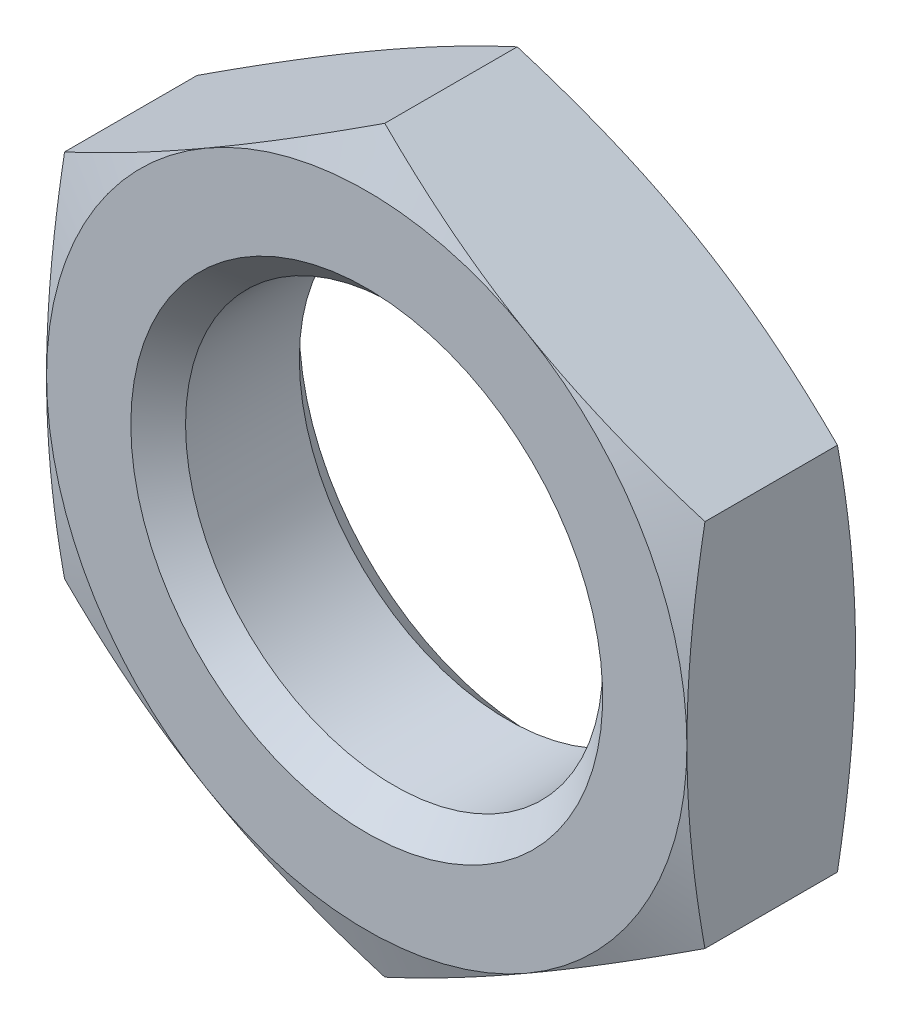
ISO-10303-21;
HEADER;
FILE_DESCRIPTION(('STEP AP214'),'2;1');
FILE_NAME('part.step','',(''),(''),'','','');
FILE_SCHEMA(('AUTOMOTIVE_DESIGN { 1 0 10303 214 1 1 1 1 }'));
ENDSEC;
DATA;
#1=APPLICATION_CONTEXT('core data for automotive mechanical design processes');
#2=APPLICATION_PROTOCOL_DEFINITION('international standard','automotive_design',2000,#1);
#3=PRODUCT_CONTEXT('',#1,'mechanical');
#4=PRODUCT('Part','Part','',(#3));
#5=PRODUCT_RELATED_PRODUCT_CATEGORY('part','',(#4));
#6=PRODUCT_DEFINITION_FORMATION('','',#4);
#7=PRODUCT_DEFINITION_CONTEXT('part definition',#1,'design');
#8=PRODUCT_DEFINITION('design','',#6,#7);
#9=PRODUCT_DEFINITION_SHAPE('','',#8);
#10=(LENGTH_UNIT() NAMED_UNIT(*) SI_UNIT(.MILLI.,.METRE.));
#11=(NAMED_UNIT(*) PLANE_ANGLE_UNIT() SI_UNIT($,.RADIAN.));
#12=(NAMED_UNIT(*) SI_UNIT($,.STERADIAN.) SOLID_ANGLE_UNIT());
#13=UNCERTAINTY_MEASURE_WITH_UNIT(LENGTH_MEASURE(1.E-05),#10,'distance_accuracy_value','');
#14=(GEOMETRIC_REPRESENTATION_CONTEXT(3) GLOBAL_UNCERTAINTY_ASSIGNED_CONTEXT((#13)) GLOBAL_UNIT_ASSIGNED_CONTEXT((#10,
#11,#12)) REPRESENTATION_CONTEXT('',''));
#15=CARTESIAN_POINT('',(0.,0.,0.));
#16=DIRECTION('',(0.,0.,1.));
#17=DIRECTION('',(1.,0.,0.));
#18=AXIS2_PLACEMENT_3D('',#15,#16,#17);
#19=CARTESIAN_POINT('',(0.,0.,-68.));
#20=DIRECTION('',(0.,0.,1.));
#21=DIRECTION('',(1.,0.,0.));
#22=AXIS2_PLACEMENT_3D('',#19,#20,#21);
#23=PLANE('',#22);
#24=CARTESIAN_POINT('',(0.,0.,-68.));
#25=DIRECTION('',(0.,0.,-1.));
#26=DIRECTION('',(-1.,0.,0.));
#27=AXIS2_PLACEMENT_3D('',#24,#25,#26);
#28=CIRCLE('',#27,7.);
#29=CARTESIAN_POINT('',(-7.,0.,-68.));
#30=VERTEX_POINT('',#29);
#31=EDGE_CURVE('E150',#30,#30,#28,.T.);
#32=ORIENTED_EDGE('',*,*,#31,.T.);
#33=EDGE_LOOP('',(#32));
#34=FACE_BOUND('',#33,.T.);
#35=CARTESIAN_POINT('',(0.,0.,-68.));
#36=DIRECTION('',(0.,0.,-1.));
#37=DIRECTION('',(1.,0.,0.));
#38=AXIS2_PLACEMENT_3D('',#35,#36,#37);
#39=CIRCLE('',#38,9.5);
#40=CARTESIAN_POINT('',(9.5,0.,-68.));
#41=VERTEX_POINT('',#40);
#42=CARTESIAN_POINT('',(4.7500000000001,-8.22724133595211,-68.));
#43=VERTEX_POINT('',#42);
#44=EDGE_CURVE('E135',#41,#43,#39,.T.);
#45=ORIENTED_EDGE('',*,*,#44,.F.);
#46=CARTESIAN_POINT('',(0.,0.,-68.));
#47=DIRECTION('',(0.,0.,-1.));
#48=DIRECTION('',(0.50000000000001,0.866025403784433,0.));
#49=AXIS2_PLACEMENT_3D('',#46,#47,#48);
#50=CIRCLE('',#49,9.5);
#51=CARTESIAN_POINT('',(4.7500000000001,8.22724133595211,-68.));
#52=VERTEX_POINT('',#51);
#53=EDGE_CURVE('E145',#52,#41,#50,.T.);
#54=ORIENTED_EDGE('',*,*,#53,.F.);
#55=CARTESIAN_POINT('',(0.,0.,-68.));
#56=DIRECTION('',(0.,0.,-1.));
#57=DIRECTION('',(-0.50000000000001,0.866025403784433,0.));
#58=AXIS2_PLACEMENT_3D('',#55,#56,#57);
#59=CIRCLE('',#58,9.5);
#60=CARTESIAN_POINT('',(-4.7500000000001,8.22724133595211,-68.));
#61=VERTEX_POINT('',#60);
#62=EDGE_CURVE('E154',#61,#52,#59,.T.);
#63=ORIENTED_EDGE('',*,*,#62,.F.);
#64=CARTESIAN_POINT('',(0.,0.,-68.));
#65=DIRECTION('',(0.,0.,-1.));
#66=DIRECTION('',(-1.,0.,0.));
#67=AXIS2_PLACEMENT_3D('',#64,#65,#66);
#68=CIRCLE('',#67,9.5);
#69=CARTESIAN_POINT('',(-9.5,0.,-68.));
#70=VERTEX_POINT('',#69);
#71=EDGE_CURVE('E156',#70,#61,#68,.T.);
#72=ORIENTED_EDGE('',*,*,#71,.F.);
#73=CARTESIAN_POINT('',(0.,0.,-68.));
#74=DIRECTION('',(0.,0.,-1.));
#75=DIRECTION('',(-0.50000000000001,-0.866025403784433,0.));
#76=AXIS2_PLACEMENT_3D('',#73,#74,#75);
#77=CIRCLE('',#76,9.5);
#78=CARTESIAN_POINT('',(-4.7500000000001,-8.22724133595211,-68.));
#79=VERTEX_POINT('',#78);
#80=EDGE_CURVE('E167',#79,#70,#77,.T.);
#81=ORIENTED_EDGE('',*,*,#80,.F.);
#82=CARTESIAN_POINT('',(0.,0.,-68.));
#83=DIRECTION('',(0.,0.,-1.));
#84=DIRECTION('',(0.50000000000001,-0.866025403784433,0.));
#85=AXIS2_PLACEMENT_3D('',#82,#83,#84);
#86=CIRCLE('',#85,9.5);
#87=EDGE_CURVE('E149',#43,#79,#86,.T.);
#88=ORIENTED_EDGE('',*,*,#87,.F.);
#89=EDGE_LOOP('',(#45,#54,#63,#72,#81,#88));
#90=FACE_BOUND('',#89,.T.);
#91=ADVANCED_FACE('F17',(#34,#90),#23,.T.);
#92=CARTESIAN_POINT('',(0.,0.,-68.));
#93=DIRECTION('',(0.,0.,1.));
#94=DIRECTION('',(1.,0.,0.));
#95=AXIS2_PLACEMENT_3D('',#92,#93,#94);
#96=CONICAL_SURFACE('',#95,7.,0.78539816339746);
#97=CARTESIAN_POINT('',(0.,0.,-68.812));
#98=DIRECTION('',(0.,0.,-1.));
#99=DIRECTION('',(-1.,0.,0.));
#100=AXIS2_PLACEMENT_3D('',#97,#98,#99);
#101=CIRCLE('',#100,6.188);
#102=CARTESIAN_POINT('',(-6.188,0.,-68.812));
#103=VERTEX_POINT('',#102);
#104=EDGE_CURVE('E138',#103,#103,#101,.T.);
#105=ORIENTED_EDGE('',*,*,#104,.T.);
#106=EDGE_LOOP('',(#105));
#107=FACE_BOUND('',#106,.T.);
#108=ORIENTED_EDGE('',*,*,#31,.F.);
#109=EDGE_LOOP('',(#108));
#110=FACE_BOUND('',#109,.T.);
#111=ADVANCED_FACE('F179',(#107,#110),#96,.F.);
#112=CARTESIAN_POINT('',(0.,0.,-68.));
#113=DIRECTION('',(0.,0.,-1.));
#114=DIRECTION('',(-1.,0.,0.));
#115=AXIS2_PLACEMENT_3D('',#112,#113,#114);
#116=CONICAL_SURFACE('',#115,9.5,1.22173047639622);
#117=CARTESIAN_POINT('',(9.5,1.38348499670315E-06,-68.0000000000001));
#118=CARTESIAN_POINT('',(9.5,-0.464012820198954,-67.999999975405));
#119=CARTESIAN_POINT('',(9.5,-0.929416929238858,-68.0125279841931));
#120=CARTESIAN_POINT('',(9.5,-1.85271083849305,-68.0612160638646));
#121=CARTESIAN_POINT('',(9.5,-2.31114037189935,-68.097264507324));
#122=CARTESIAN_POINT('',(9.5,-3.22524518274052,-68.1903406242432));
#123=CARTESIAN_POINT('',(9.5,-3.67928453926669,-68.2471816991538));
#124=CARTESIAN_POINT('',(9.5,-4.35871646390742,-68.3458200965081));
#125=CARTESIAN_POINT('',(9.5,-4.58438216619538,-68.380850645372));
#126=CARTESIAN_POINT('',(9.5,-4.92256697816938,-68.4364504855607));
#127=CARTESIAN_POINT('',(9.5,-5.03514353656033,-68.4554771751788));
#128=CARTESIAN_POINT('',(9.5,-5.26014128155568,-68.494491784782));
#129=CARTESIAN_POINT('',(9.5,-5.37251523150554,-68.5144715433614));
#130=CARTESIAN_POINT('',(9.5,-5.48482799568445,-68.5349107961312));
#131=B_SPLINE_CURVE_WITH_KNOTS('',3,(#117,#118,#119,#120,#121,#122,#123,#124,#125,#126,#127,
#128,#129,#130),.UNSPECIFIED.,.F.,.F.,(4,2,2,2,2,2,4),(16.8427370557451,18.2242554711314,
19.6057738865176,20.9872923019039,21.678051509597,22.0234311134436,22.3688107172901),.UNSPECIFIED.);
#132=CARTESIAN_POINT('',(9.5,-5.4848275573014,-68.5349107163522));
#133=VERTEX_POINT('',#132);
#134=EDGE_CURVE('E116',#41,#133,#131,.T.);
#135=ORIENTED_EDGE('',*,*,#134,.F.);
#136=ORIENTED_EDGE('',*,*,#44,.T.);
#137=CARTESIAN_POINT('',(9.50000000003373,-5.48482755728192,-68.5349107163593));
#138=CARTESIAN_POINT('',(8.71314308510471,-5.93911960892993,-68.3695619318949));
#139=CARTESIAN_POINT('',(7.91972598113348,-6.39719918748738,-68.2338856319153));
#140=CARTESIAN_POINT('',(6.33363378100409,-7.31292994619168,-68.0488840555385));
#141=CARTESIAN_POINT('',(5.54432931596682,-7.76863509155353,-68.));
#142=CARTESIAN_POINT('',(4.75000000000011,-8.22724133595213,-68.));
#143=B_SPLINE_CURVE_WITH_KNOTS('',3,(#137,#138,#139,#140,#141,#142),.UNSPECIFIED.,.F.,.F.,(4,2,
4),(0.000230940107676242,2.74264471875835,5.48505849740902),.UNSPECIFIED.);
#144=EDGE_CURVE('E136',#133,#43,#143,.T.);
#145=ORIENTED_EDGE('',*,*,#144,.F.);
#146=EDGE_LOOP('',(#135,#136,#145));
#147=FACE_BOUND('',#146,.T.);
#148=ADVANCED_FACE('F134',(#147),#116,.T.);
#149=CARTESIAN_POINT('',(4.75000000000011,8.22724133595213,-68.));
#150=CARTESIAN_POINT('',(5.54432931596682,7.76863509155353,-68.));
#151=CARTESIAN_POINT('',(6.33363378100409,7.31292994619168,-68.0488840555385));
#152=CARTESIAN_POINT('',(7.91972598113348,6.39719918748738,-68.2338856319153));
#153=CARTESIAN_POINT('',(8.71314308510471,5.93911960892993,-68.3695619318949));
#154=CARTESIAN_POINT('',(9.50000000003374,5.48482755728192,-68.5349107163593));
#155=B_SPLINE_CURVE_WITH_KNOTS('',3,(#149,#150,#151,#152,#153,#154),.UNSPECIFIED.,.F.,.F.,(4,2,
4),(5.4850584974093,8.22747227605997,10.9698860547106),.UNSPECIFIED.);
#156=CARTESIAN_POINT('',(9.5,5.4848275573014,-68.5349107163522));
#157=VERTEX_POINT('',#156);
#158=EDGE_CURVE('E126',#52,#157,#155,.T.);
#159=ORIENTED_EDGE('',*,*,#158,.F.);
#160=ORIENTED_EDGE('',*,*,#53,.T.);
#161=CARTESIAN_POINT('',(9.5,5.48482732909347,-68.5349106748217));
#162=CARTESIAN_POINT('',(9.5,4.70294050262704,-68.3926189135627));
#163=CARTESIAN_POINT('',(9.5,3.9212297111591,-68.2729048868647));
#164=CARTESIAN_POINT('',(9.5,2.33480815285478,-68.0923210251811));
#165=CARTESIAN_POINT('',(9.5,1.53357894294689,-68.0326247100878));
#166=CARTESIAN_POINT('',(9.5,0.487580135297328,-68.0034263923986));
#167=CARTESIAN_POINT('',(9.5,0.243629924306138,-68.0000000129136));
#168=CARTESIAN_POINT('',(9.5,1.38348499670315E-06,-68.0000000000001));
#169=B_SPLINE_CURVE_WITH_KNOTS('',3,(#161,#162,#163,#164,#165,#166,#167,#168),.UNSPECIFIED.,.F.,
.F.,(4,2,2,4),(11.3677272295462,13.745187328469,16.1226474273918,16.8427370557451),.UNSPECIFIED.);
#170=EDGE_CURVE('E111',#157,#41,#169,.T.);
#171=ORIENTED_EDGE('',*,*,#170,.F.);
#172=EDGE_LOOP('',(#159,#160,#171));
#173=FACE_BOUND('',#172,.T.);
#174=ADVANCED_FACE('F152',(#173),#116,.T.);
#175=CARTESIAN_POINT('',(-4.75000000000012,8.22724133595213,-68.));
#176=CARTESIAN_POINT('',(-3.95567068403337,8.68584758035076,-68.));
#177=CARTESIAN_POINT('',(-3.16636621899606,9.14155272571263,-68.0488840555386));
#178=CARTESIAN_POINT('',(-1.58027401886659,10.057283484417,-68.2338856319153));
#179=CARTESIAN_POINT('',(-0.78685691489532,10.5153630629745,-68.369561931895));
#180=CARTESIAN_POINT('',(3.37510244465745E-11,10.9696551146225,-68.5349107163593));
#181=B_SPLINE_CURVE_WITH_KNOTS('',3,(#175,#176,#177,#178,#179,#180),.UNSPECIFIED.,.F.,.F.,(4,2,
4),(5.48505849740902,8.22747227605984,10.9698860547106),.UNSPECIFIED.);
#182=CARTESIAN_POINT('',(0.,10.969655114603,-68.5349107163523));
#183=VERTEX_POINT('',#182);
#184=EDGE_CURVE('E125',#61,#183,#181,.T.);
#185=ORIENTED_EDGE('',*,*,#184,.F.);
#186=ORIENTED_EDGE('',*,*,#62,.T.);
#187=CARTESIAN_POINT('',(-3.37473105016528E-11,10.9696551146225,-68.5349107163593));
#188=CARTESIAN_POINT('',(0.786856914895322,10.5153630629745,-68.369561931895));
#189=CARTESIAN_POINT('',(1.5802740188666,10.057283484417,-68.2338856319153));
#190=CARTESIAN_POINT('',(3.16636621899606,9.14155272571263,-68.0488840555386));
#191=CARTESIAN_POINT('',(3.95567068403337,8.68584758035076,-68.));
#192=CARTESIAN_POINT('',(4.75000000000011,8.22724133595213,-68.));
#193=B_SPLINE_CURVE_WITH_KNOTS('',3,(#187,#188,#189,#190,#191,#192),.UNSPECIFIED.,.F.,.F.,(4,2,
4),(0.00023094010767663,2.74264471875849,5.4850584974093),.UNSPECIFIED.);
#194=EDGE_CURVE('E282',#183,#52,#193,.T.);
#195=ORIENTED_EDGE('',*,*,#194,.F.);
#196=EDGE_LOOP('',(#185,#186,#195));
#197=FACE_BOUND('',#196,.T.);
#198=ADVANCED_FACE('F281',(#197),#116,.T.);
#199=ORIENTED_EDGE('',*,*,#71,.T.);
#200=CARTESIAN_POINT('',(-9.50000000003373,5.48482755728192,-68.5349107163593));
#201=CARTESIAN_POINT('',(-8.71314308510471,5.93911960892993,-68.3695619318949));
#202=CARTESIAN_POINT('',(-7.91972598113348,6.39719918748738,-68.2338856319153));
#203=CARTESIAN_POINT('',(-6.33363378100409,7.31292994619168,-68.0488840555386));
#204=CARTESIAN_POINT('',(-5.54432931596683,7.76863509155353,-68.));
#205=CARTESIAN_POINT('',(-4.75000000000012,8.22724133595213,-68.));
#206=B_SPLINE_CURVE_WITH_KNOTS('',3,(#200,#201,#202,#203,#204,#205),.UNSPECIFIED.,.F.,.F.,(4,2,
4),(0.000230940107676242,2.74264471875835,5.48505849740902),.UNSPECIFIED.);
#207=CARTESIAN_POINT('',(-9.5,5.4848275573014,-68.5349107163522));
#208=VERTEX_POINT('',#207);
#209=EDGE_CURVE('E292',#208,#61,#206,.T.);
#210=ORIENTED_EDGE('',*,*,#209,.F.);
#211=CARTESIAN_POINT('',(-9.5,-1.38348498976426E-06,-68.0000000000001));
#212=CARTESIAN_POINT('',(-9.5,0.46401282019896,-67.999999975405));
#213=CARTESIAN_POINT('',(-9.5,0.929416929238863,-68.0125279841931));
#214=CARTESIAN_POINT('',(-9.5,1.85271083849305,-68.0612160638646));
#215=CARTESIAN_POINT('',(-9.5,2.31114037189935,-68.097264507324));
#216=CARTESIAN_POINT('',(-9.5,3.22524518274052,-68.1903406242432));
#217=CARTESIAN_POINT('',(-9.5,3.67928453926669,-68.2471816991538));
#218=CARTESIAN_POINT('',(-9.5,4.35871646390742,-68.3458200965082));
#219=CARTESIAN_POINT('',(-9.5,4.58438216619538,-68.380850645372));
#220=CARTESIAN_POINT('',(-9.5,4.92256697816938,-68.4364504855607));
#221=CARTESIAN_POINT('',(-9.5,5.03514353656033,-68.4554771751788));
#222=CARTESIAN_POINT('',(-9.5,5.26014128155568,-68.494491784782));
#223=CARTESIAN_POINT('',(-9.5,5.37251523150554,-68.5144715433614));
#224=CARTESIAN_POINT('',(-9.5,5.48482799568445,-68.5349107961312));
#225=B_SPLINE_CURVE_WITH_KNOTS('',3,(#211,#212,#213,#214,#215,#216,#217,#218,#219,#220,#221,
#222,#223,#224),.UNSPECIFIED.,.F.,.F.,(4,2,2,2,2,2,4),(16.8427370557451,18.2242554711314,
19.6057738865176,20.9872923019039,21.678051509597,22.0234311134436,22.3688107172901),.UNSPECIFIED.);
#226=EDGE_CURVE('E293',#70,#208,#225,.T.);
#227=ORIENTED_EDGE('',*,*,#226,.F.);
#228=EDGE_LOOP('',(#199,#210,#227));
#229=FACE_BOUND('',#228,.T.);
#230=ADVANCED_FACE('F291',(#229),#116,.T.);
#231=ORIENTED_EDGE('',*,*,#80,.T.);
#232=CARTESIAN_POINT('',(-9.5,-5.48482732909346,-68.5349106748217));
#233=CARTESIAN_POINT('',(-9.5,-4.70294050262704,-68.3926189135627));
#234=CARTESIAN_POINT('',(-9.5,-3.9212297111591,-68.2729048868647));
#235=CARTESIAN_POINT('',(-9.5,-2.33480815285478,-68.0923210251811));
#236=CARTESIAN_POINT('',(-9.5,-1.53357894294689,-68.0326247100878));
#237=CARTESIAN_POINT('',(-9.5,-0.487580135297326,-68.0034263923986));
#238=CARTESIAN_POINT('',(-9.5,-0.243629924306135,-68.0000000129136));
#239=CARTESIAN_POINT('',(-9.5,-1.38348498976426E-06,-68.0000000000001));
#240=B_SPLINE_CURVE_WITH_KNOTS('',3,(#232,#233,#234,#235,#236,#237,#238,#239),.UNSPECIFIED.,.F.,
.F.,(4,2,2,4),(11.3677272295462,13.745187328469,16.1226474273918,16.8427370557451),.UNSPECIFIED.);
#241=CARTESIAN_POINT('',(-9.5,-5.4848275573014,-68.5349107163522));
#242=VERTEX_POINT('',#241);
#243=EDGE_CURVE('E298',#242,#70,#240,.T.);
#244=ORIENTED_EDGE('',*,*,#243,.F.);
#245=CARTESIAN_POINT('',(-4.75000000000011,-8.22724133595214,-68.));
#246=CARTESIAN_POINT('',(-5.54432931596682,-7.76863509155353,-68.));
#247=CARTESIAN_POINT('',(-6.33363378100409,-7.31292994619168,-68.0488840555385));
#248=CARTESIAN_POINT('',(-7.91972598113348,-6.39719918748738,-68.2338856319153));
#249=CARTESIAN_POINT('',(-8.71314308510471,-5.93911960892993,-68.3695619318949));
#250=CARTESIAN_POINT('',(-9.50000000003374,-5.48482755728192,-68.5349107163593));
#251=B_SPLINE_CURVE_WITH_KNOTS('',3,(#245,#246,#247,#248,#249,#250),.UNSPECIFIED.,.F.,.F.,(4,2,
4),(5.4850584974093,8.22747227605997,10.9698860547106),.UNSPECIFIED.);
#252=EDGE_CURVE('E299',#79,#242,#251,.T.);
#253=ORIENTED_EDGE('',*,*,#252,.F.);
#254=EDGE_LOOP('',(#231,#244,#253));
#255=FACE_BOUND('',#254,.T.);
#256=ADVANCED_FACE('F194',(#255),#116,.T.);
#257=ORIENTED_EDGE('',*,*,#87,.T.);
#258=CARTESIAN_POINT('',(3.37438410547009E-11,-10.9696551146225,-68.5349107163593));
#259=CARTESIAN_POINT('',(-0.786856914895323,-10.5153630629745,-68.369561931895));
#260=CARTESIAN_POINT('',(-1.58027401886659,-10.057283484417,-68.2338856319153));
#261=CARTESIAN_POINT('',(-3.16636621899606,-9.14155272571264,-68.0488840555386));
#262=CARTESIAN_POINT('',(-3.95567068403336,-8.68584758035076,-68.));
#263=CARTESIAN_POINT('',(-4.75000000000011,-8.22724133595214,-68.));
#264=B_SPLINE_CURVE_WITH_KNOTS('',3,(#258,#259,#260,#261,#262,#263),.UNSPECIFIED.,.F.,.F.,(4,2,
4),(0.000230940107677241,2.74264471875849,5.4850584974093),.UNSPECIFIED.);
#265=CARTESIAN_POINT('',(0.,-10.969655114603,-68.5349107163523));
#266=VERTEX_POINT('',#265);
#267=EDGE_CURVE('E452',#266,#79,#264,.T.);
#268=ORIENTED_EDGE('',*,*,#267,.F.);
#269=CARTESIAN_POINT('',(4.75000000000011,-8.22724133595213,-68.));
#270=CARTESIAN_POINT('',(3.95567068403337,-8.68584758035076,-68.));
#271=CARTESIAN_POINT('',(3.16636621899607,-9.14155272571263,-68.0488840555386));
#272=CARTESIAN_POINT('',(1.5802740188666,-10.057283484417,-68.2338856319153));
#273=CARTESIAN_POINT('',(0.786856914895322,-10.5153630629745,-68.369561931895));
#274=CARTESIAN_POINT('',(-3.37481022831659E-11,-10.9696551146225,-68.5349107163593));
#275=B_SPLINE_CURVE_WITH_KNOTS('',3,(#269,#270,#271,#272,#273,#274),.UNSPECIFIED.,.F.,.F.,(4,2,
4),(5.48505849740902,8.22747227605984,10.9698860547106),.UNSPECIFIED.);
#276=EDGE_CURVE('E400',#43,#266,#275,.T.);
#277=ORIENTED_EDGE('',*,*,#276,.F.);
#278=EDGE_LOOP('',(#257,#268,#277));
#279=FACE_BOUND('',#278,.T.);
#280=ADVANCED_FACE('F184',(#279),#116,.T.);
#281=CARTESIAN_POINT('',(0.,0.,-500.));
#282=DIRECTION('',(0.,0.,-1.));
#283=DIRECTION('',(-1.,0.,0.));
#284=AXIS2_PLACEMENT_3D('',#281,#282,#283);
#285=CYLINDRICAL_SURFACE('',#284,6.188);
#286=CARTESIAN_POINT('',(0.,0.,-72.188));
#287=DIRECTION('',(0.,0.,-1.));
#288=DIRECTION('',(-1.,0.,0.));
#289=AXIS2_PLACEMENT_3D('',#286,#287,#288);
#290=CIRCLE('',#289,6.188);
#291=CARTESIAN_POINT('',(-6.188,0.,-72.188));
#292=VERTEX_POINT('',#291);
#293=EDGE_CURVE('E448',#292,#292,#290,.T.);
#294=ORIENTED_EDGE('',*,*,#293,.T.);
#295=EDGE_LOOP('',(#294));
#296=FACE_BOUND('',#295,.T.);
#297=ORIENTED_EDGE('',*,*,#104,.F.);
#298=EDGE_LOOP('',(#297));
#299=FACE_BOUND('',#298,.T.);
#300=ADVANCED_FACE('F182',(#296,#299),#285,.F.);
#301=CARTESIAN_POINT('',(9.5,-5.4848275573014,-68.));
#302=DIRECTION('',(-1.,0.,0.));
#303=DIRECTION('',(0.,0.,1.));
#304=AXIS2_PLACEMENT_3D('',#301,#302,#303);
#305=PLANE('',#304);
#306=DIRECTION('',(0.,0.,-1.));
#307=VECTOR('',#306,1.);
#308=CARTESIAN_POINT('',(9.5,5.4848275573014,-68.5349107163522));
#309=LINE('',#308,#307);
#310=CARTESIAN_POINT('',(9.5,5.4848275573014,-72.4650892836478));
#311=VERTEX_POINT('',#310);
#312=EDGE_CURVE('E120',#157,#311,#309,.T.);
#313=ORIENTED_EDGE('',*,*,#312,.F.);
#314=ORIENTED_EDGE('',*,*,#170,.T.);
#315=ORIENTED_EDGE('',*,*,#134,.T.);
#316=DIRECTION('',(0.,0.,-1.));
#317=VECTOR('',#316,1.);
#318=CARTESIAN_POINT('',(9.5,-5.4848275573014,-68.5349107163522));
#319=LINE('',#318,#317);
#320=CARTESIAN_POINT('',(9.5,-5.4848275573014,-72.4650892836478));
#321=VERTEX_POINT('',#320);
#322=EDGE_CURVE('E440',#133,#321,#319,.T.);
#323=ORIENTED_EDGE('',*,*,#322,.T.);
#324=CARTESIAN_POINT('',(9.5,-5.48482732909346,-72.4650893251783));
#325=CARTESIAN_POINT('',(9.5,-4.70294050262723,-72.6073810864372));
#326=CARTESIAN_POINT('',(9.5,-3.92122971115948,-72.7270951131353));
#327=CARTESIAN_POINT('',(9.5,-2.33480815285556,-72.9076789748188));
#328=CARTESIAN_POINT('',(9.5,-1.53357894294787,-72.9673752899122));
#329=CARTESIAN_POINT('',(9.5,-0.48758013529812,-72.9965736076014));
#330=CARTESIAN_POINT('',(9.5,-0.243629924306536,-72.9999999870865));
#331=CARTESIAN_POINT('',(9.5,-1.38348499757052E-06,-73.));
#332=B_SPLINE_CURVE_WITH_KNOTS('',3,(#324,#325,#326,#327,#328,#329,#330,#331),.UNSPECIFIED.,.F.,
.F.,(4,2,2,4),(11.3677272295462,13.7451873284685,16.1226474273907,16.8427370557452),.UNSPECIFIED.);
#333=CARTESIAN_POINT('',(9.5,0.,-73.));
#334=VERTEX_POINT('',#333);
#335=EDGE_CURVE('E436',#321,#334,#332,.T.);
#336=ORIENTED_EDGE('',*,*,#335,.T.);
#337=CARTESIAN_POINT('',(9.5,-1.38348499757052E-06,-73.));
#338=CARTESIAN_POINT('',(9.5,0.464012820198954,-73.000000024595));
#339=CARTESIAN_POINT('',(9.5,0.929416929238861,-72.987472015807));
#340=CARTESIAN_POINT('',(9.5,1.85271083849305,-72.9387839361355));
#341=CARTESIAN_POINT('',(9.5,2.31114037189934,-72.902735492676));
#342=CARTESIAN_POINT('',(9.5,3.22524518274051,-72.8096593757568));
#343=CARTESIAN_POINT('',(9.5,3.67928453926668,-72.7528183008463));
#344=CARTESIAN_POINT('',(9.5,4.3587164639074,-72.6541799034919));
#345=CARTESIAN_POINT('',(9.5,4.58438216619538,-72.619149354628));
#346=CARTESIAN_POINT('',(9.5,4.92256697816938,-72.5635495144393));
#347=CARTESIAN_POINT('',(9.5,5.03514353656031,-72.5445228248211));
#348=CARTESIAN_POINT('',(9.5,5.26014128155566,-72.505508215218));
#349=CARTESIAN_POINT('',(9.5,5.37251523150552,-72.4855284566386));
#350=CARTESIAN_POINT('',(9.5,5.48482799568442,-72.4650892038687));
#351=B_SPLINE_CURVE_WITH_KNOTS('',3,(#337,#338,#339,#340,#341,#342,#343,#344,#345,#346,#347,
#348,#349,#350),.UNSPECIFIED.,.F.,.F.,(4,2,2,2,2,2,4),(16.8427370557452,18.2242554711315,
19.6057738865177,20.987292301904,21.6780515095971,22.0234311134437,22.3688107172903),.UNSPECIFIED.);
#352=EDGE_CURVE('E388',#334,#311,#351,.T.);
#353=ORIENTED_EDGE('',*,*,#352,.T.);
#354=EDGE_LOOP('',(#313,#314,#315,#323,#336,#353));
#355=FACE_BOUND('',#354,.T.);
#356=ADVANCED_FACE('F114',(#355),#305,.F.);
#357=CARTESIAN_POINT('',(0.,-10.969655114603,-68.));
#358=DIRECTION('',(-0.500000000000011,0.866025403784432,0.));
#359=DIRECTION('',(-0.866025403784432,-0.500000000000011,0.));
#360=AXIS2_PLACEMENT_3D('',#357,#358,#359);
#361=PLANE('',#360);
#362=ORIENTED_EDGE('',*,*,#322,.F.);
#363=ORIENTED_EDGE('',*,*,#144,.T.);
#364=ORIENTED_EDGE('',*,*,#276,.T.);
#365=DIRECTION('',(0.,0.,-1.));
#366=VECTOR('',#365,1.);
#367=CARTESIAN_POINT('',(0.,-10.969655114603,-68.5349107163523));
#368=LINE('',#367,#366);
#369=CARTESIAN_POINT('',(0.,-10.969655114603,-72.4650892836477));
#370=VERTEX_POINT('',#369);
#371=EDGE_CURVE('E386',#266,#370,#368,.T.);
#372=ORIENTED_EDGE('',*,*,#371,.T.);
#373=CARTESIAN_POINT('',(-3.37358758115867E-11,-10.9696551146225,-72.4650892836406));
#374=CARTESIAN_POINT('',(0.786856914895329,-10.5153630629745,-72.630438068105));
#375=CARTESIAN_POINT('',(1.5802740188666,-10.057283484417,-72.7661143680847));
#376=CARTESIAN_POINT('',(3.16636621899606,-9.14155272571264,-72.9511159444615));
#377=CARTESIAN_POINT('',(3.95567068403336,-8.68584758035076,-73.));
#378=CARTESIAN_POINT('',(4.75000000000011,-8.22724133595214,-73.));
#379=B_SPLINE_CURVE_WITH_KNOTS('',3,(#373,#374,#375,#376,#377,#378),.UNSPECIFIED.,.F.,.F.,(4,2,
4),(0.000230940107677768,2.74264471875849,5.48505849740929),.UNSPECIFIED.);
#380=CARTESIAN_POINT('',(4.7500000000001,-8.22724133595211,-73.));
#381=VERTEX_POINT('',#380);
#382=EDGE_CURVE('E360',#370,#381,#379,.T.);
#383=ORIENTED_EDGE('',*,*,#382,.T.);
#384=CARTESIAN_POINT('',(4.75000000000011,-8.22724133595214,-73.));
#385=CARTESIAN_POINT('',(5.54432931596682,-7.76863509155353,-73.));
#386=CARTESIAN_POINT('',(6.33363378100409,-7.31292994619168,-72.9511159444615));
#387=CARTESIAN_POINT('',(7.91972598113348,-6.39719918748738,-72.7661143680847));
#388=CARTESIAN_POINT('',(8.71314308510471,-5.93911960892992,-72.6304380681051));
#389=CARTESIAN_POINT('',(9.50000000003374,-5.48482755728192,-72.4650892836407));
#390=B_SPLINE_CURVE_WITH_KNOTS('',3,(#384,#385,#386,#387,#388,#389),.UNSPECIFIED.,.F.,.F.,(4,2,
4),(5.48505849740929,8.22747227605997,10.9698860547106),.UNSPECIFIED.);
#391=EDGE_CURVE('E358',#381,#321,#390,.T.);
#392=ORIENTED_EDGE('',*,*,#391,.T.);
#393=EDGE_LOOP('',(#362,#363,#364,#372,#383,#392));
#394=FACE_BOUND('',#393,.T.);
#395=ADVANCED_FACE('F192',(#394),#361,.F.);
#396=CARTESIAN_POINT('',(9.5,5.4848275573014,-68.));
#397=DIRECTION('',(-0.500000000000011,-0.866025403784432,0.));
#398=DIRECTION('',(0.866025403784432,-0.500000000000011,0.));
#399=AXIS2_PLACEMENT_3D('',#396,#397,#398);
#400=PLANE('',#399);
#401=DIRECTION('',(0.,0.,-1.));
#402=VECTOR('',#401,1.);
#403=CARTESIAN_POINT('',(0.,10.969655114603,-68.5349107163523));
#404=LINE('',#403,#402);
#405=CARTESIAN_POINT('',(0.,10.969655114603,-72.4650892836477));
#406=VERTEX_POINT('',#405);
#407=EDGE_CURVE('E306',#183,#406,#404,.T.);
#408=ORIENTED_EDGE('',*,*,#407,.F.);
#409=ORIENTED_EDGE('',*,*,#194,.T.);
#410=ORIENTED_EDGE('',*,*,#158,.T.);
#411=ORIENTED_EDGE('',*,*,#312,.T.);
#412=CARTESIAN_POINT('',(9.50000000003374,5.48482755728192,-72.4650892836407));
#413=CARTESIAN_POINT('',(8.71314308510471,5.93911960892992,-72.6304380681051));
#414=CARTESIAN_POINT('',(7.91972598113348,6.39719918748738,-72.7661143680847));
#415=CARTESIAN_POINT('',(6.33363378100409,7.31292994619168,-72.9511159444615));
#416=CARTESIAN_POINT('',(5.54432931596682,7.76863509155353,-73.));
#417=CARTESIAN_POINT('',(4.75000000000011,8.22724133595213,-73.));
#418=B_SPLINE_CURVE_WITH_KNOTS('',3,(#412,#413,#414,#415,#416,#417),.UNSPECIFIED.,.F.,.F.,(4,2,
4),(0.000230940107676242,2.74264471875835,5.48505849740903),.UNSPECIFIED.);
#419=CARTESIAN_POINT('',(4.7500000000001,8.22724133595211,-73.));
#420=VERTEX_POINT('',#419);
#421=EDGE_CURVE('E348',#311,#420,#418,.T.);
#422=ORIENTED_EDGE('',*,*,#421,.T.);
#423=CARTESIAN_POINT('',(4.75000000000011,8.22724133595213,-73.));
#424=CARTESIAN_POINT('',(3.95567068403336,8.68584758035076,-73.));
#425=CARTESIAN_POINT('',(3.16636621899606,9.14155272571264,-72.9511159444615));
#426=CARTESIAN_POINT('',(1.58027401886659,10.057283484417,-72.7661143680847));
#427=CARTESIAN_POINT('',(0.786856914895327,10.5153630629745,-72.630438068105));
#428=CARTESIAN_POINT('',(-3.37369021607969E-11,10.9696551146225,-72.4650892836406));
#429=B_SPLINE_CURVE_WITH_KNOTS('',3,(#423,#424,#425,#426,#427,#428),.UNSPECIFIED.,.F.,.F.,(4,2,
4),(5.48505849740903,8.22747227605984,10.9698860547106),.UNSPECIFIED.);
#430=EDGE_CURVE('E347',#420,#406,#429,.T.);
#431=ORIENTED_EDGE('',*,*,#430,.T.);
#432=EDGE_LOOP('',(#408,#409,#410,#411,#422,#431));
#433=FACE_BOUND('',#432,.T.);
#434=ADVANCED_FACE('F303',(#433),#400,.F.);
#435=CARTESIAN_POINT('',(0.,10.969655114603,-68.));
#436=DIRECTION('',(0.500000000000011,-0.866025403784432,0.));
#437=DIRECTION('',(0.866025403784432,0.500000000000011,0.));
#438=AXIS2_PLACEMENT_3D('',#435,#436,#437);
#439=PLANE('',#438);
#440=DIRECTION('',(0.,0.,-1.));
#441=VECTOR('',#440,1.);
#442=CARTESIAN_POINT('',(-9.5,5.4848275573014,-68.5349107163522));
#443=LINE('',#442,#441);
#444=CARTESIAN_POINT('',(-9.5,5.4848275573014,-72.4650892836478));
#445=VERTEX_POINT('',#444);
#446=EDGE_CURVE('E352',#208,#445,#443,.T.);
#447=ORIENTED_EDGE('',*,*,#446,.F.);
#448=ORIENTED_EDGE('',*,*,#209,.T.);
#449=ORIENTED_EDGE('',*,*,#184,.T.);
#450=ORIENTED_EDGE('',*,*,#407,.T.);
#451=CARTESIAN_POINT('',(3.37353762112256E-11,10.9696551146225,-72.4650892836406));
#452=CARTESIAN_POINT('',(-0.786856914895331,10.5153630629744,-72.630438068105));
#453=CARTESIAN_POINT('',(-1.5802740188666,10.057283484417,-72.7661143680847));
#454=CARTESIAN_POINT('',(-3.16636621899607,9.14155272571263,-72.9511159444615));
#455=CARTESIAN_POINT('',(-3.95567068403337,8.68584758035076,-73.));
#456=CARTESIAN_POINT('',(-4.75000000000011,8.22724133595213,-73.));
#457=B_SPLINE_CURVE_WITH_KNOTS('',3,(#451,#452,#453,#454,#455,#456),.UNSPECIFIED.,.F.,.F.,(4,2,
4),(0.000230940107677768,2.74264471875849,5.48505849740929),.UNSPECIFIED.);
#458=CARTESIAN_POINT('',(-4.7500000000001,8.22724133595211,-73.));
#459=VERTEX_POINT('',#458);
#460=EDGE_CURVE('E355',#406,#459,#457,.T.);
#461=ORIENTED_EDGE('',*,*,#460,.T.);
#462=CARTESIAN_POINT('',(-4.75000000000011,8.22724133595213,-73.));
#463=CARTESIAN_POINT('',(-5.54432931596682,7.76863509155353,-73.));
#464=CARTESIAN_POINT('',(-6.33363378100409,7.31292994619168,-72.9511159444615));
#465=CARTESIAN_POINT('',(-7.91972598113348,6.39719918748738,-72.7661143680847));
#466=CARTESIAN_POINT('',(-8.71314308510471,5.93911960892992,-72.6304380681051));
#467=CARTESIAN_POINT('',(-9.50000000003374,5.48482755728192,-72.4650892836407));
#468=B_SPLINE_CURVE_WITH_KNOTS('',3,(#462,#463,#464,#465,#466,#467),.UNSPECIFIED.,.F.,.F.,(4,2,
4),(5.48505849740929,8.22747227605997,10.9698860547106),.UNSPECIFIED.);
#469=EDGE_CURVE('E472',#459,#445,#468,.T.);
#470=ORIENTED_EDGE('',*,*,#469,.T.);
#471=EDGE_LOOP('',(#447,#448,#449,#450,#461,#470));
#472=FACE_BOUND('',#471,.T.);
#473=ADVANCED_FACE('F324',(#472),#439,.F.);
#474=CARTESIAN_POINT('',(-9.5,5.4848275573014,-68.));
#475=DIRECTION('',(1.,0.,0.));
#476=DIRECTION('',(0.,0.,-1.));
#477=AXIS2_PLACEMENT_3D('',#474,#475,#476);
#478=PLANE('',#477);
#479=DIRECTION('',(0.,0.,-1.));
#480=VECTOR('',#479,1.);
#481=CARTESIAN_POINT('',(-9.5,-5.4848275573014,-68.5349107163522));
#482=LINE('',#481,#480);
#483=CARTESIAN_POINT('',(-9.5,-5.4848275573014,-72.4650892836478));
#484=VERTEX_POINT('',#483);
#485=EDGE_CURVE('E461',#242,#484,#482,.T.);
#486=ORIENTED_EDGE('',*,*,#485,.F.);
#487=ORIENTED_EDGE('',*,*,#243,.T.);
#488=ORIENTED_EDGE('',*,*,#226,.T.);
#489=ORIENTED_EDGE('',*,*,#446,.T.);
#490=CARTESIAN_POINT('',(-9.5,5.48482732909345,-72.4650893251783));
#491=CARTESIAN_POINT('',(-9.5,4.70294050262723,-72.6073810864372));
#492=CARTESIAN_POINT('',(-9.5,3.92122971115948,-72.7270951131352));
#493=CARTESIAN_POINT('',(-9.5,2.33480815285556,-72.9076789748188));
#494=CARTESIAN_POINT('',(-9.5,1.53357894294787,-72.9673752899121));
#495=CARTESIAN_POINT('',(-9.5,0.487580135298121,-72.9965736076014));
#496=CARTESIAN_POINT('',(-9.5,0.243629924306535,-72.9999999870865));
#497=CARTESIAN_POINT('',(-9.5,1.38348499670315E-06,-73.));
#498=B_SPLINE_CURVE_WITH_KNOTS('',3,(#490,#491,#492,#493,#494,#495,#496,#497),.UNSPECIFIED.,.F.,
.F.,(4,2,2,4),(11.3677272295462,13.7451873284685,16.1226474273907,16.8427370557452),.UNSPECIFIED.);
#499=CARTESIAN_POINT('',(-9.5,0.,-73.));
#500=VERTEX_POINT('',#499);
#501=EDGE_CURVE('E471',#445,#500,#498,.T.);
#502=ORIENTED_EDGE('',*,*,#501,.T.);
#503=CARTESIAN_POINT('',(-9.5,1.38348499670315E-06,-73.));
#504=CARTESIAN_POINT('',(-9.5,-0.464012820198955,-73.000000024595));
#505=CARTESIAN_POINT('',(-9.5,-0.929416929238863,-72.987472015807));
#506=CARTESIAN_POINT('',(-9.5,-1.85271083849305,-72.9387839361355));
#507=CARTESIAN_POINT('',(-9.5,-2.31114037189934,-72.902735492676));
#508=CARTESIAN_POINT('',(-9.5,-3.22524518274051,-72.8096593757568));
#509=CARTESIAN_POINT('',(-9.5,-3.67928453926667,-72.7528183008463));
#510=CARTESIAN_POINT('',(-9.5,-4.3587164639074,-72.6541799034919));
#511=CARTESIAN_POINT('',(-9.5,-4.58438216619538,-72.6191493546279));
#512=CARTESIAN_POINT('',(-9.5,-4.92256697816938,-72.5635495144393));
#513=CARTESIAN_POINT('',(-9.5,-5.03514353656031,-72.5445228248211));
#514=CARTESIAN_POINT('',(-9.5,-5.26014128155567,-72.505508215218));
#515=CARTESIAN_POINT('',(-9.5,-5.37251523150552,-72.4855284566386));
#516=CARTESIAN_POINT('',(-9.5,-5.48482799568442,-72.4650892038687));
#517=B_SPLINE_CURVE_WITH_KNOTS('',3,(#503,#504,#505,#506,#507,#508,#509,#510,#511,#512,#513,
#514,#515,#516),.UNSPECIFIED.,.F.,.F.,(4,2,2,2,2,2,4),(16.8427370557452,18.2242554711315,
19.6057738865177,20.987292301904,21.6780515095971,22.0234311134437,22.3688107172903),.UNSPECIFIED.);
#518=EDGE_CURVE('E469',#500,#484,#517,.T.);
#519=ORIENTED_EDGE('',*,*,#518,.T.);
#520=EDGE_LOOP('',(#486,#487,#488,#489,#502,#519));
#521=FACE_BOUND('',#520,.T.);
#522=ADVANCED_FACE('F466',(#521),#478,.F.);
#523=CARTESIAN_POINT('',(-9.5,-5.4848275573014,-68.));
#524=DIRECTION('',(0.500000000000011,0.866025403784432,0.));
#525=DIRECTION('',(-0.866025403784432,0.500000000000011,0.));
#526=AXIS2_PLACEMENT_3D('',#523,#524,#525);
#527=PLANE('',#526);
#528=ORIENTED_EDGE('',*,*,#371,.F.);
#529=ORIENTED_EDGE('',*,*,#267,.T.);
#530=ORIENTED_EDGE('',*,*,#252,.T.);
#531=ORIENTED_EDGE('',*,*,#485,.T.);
#532=CARTESIAN_POINT('',(-9.50000000003374,-5.48482755728192,-72.4650892836407));
#533=CARTESIAN_POINT('',(-8.71314308510471,-5.93911960892992,-72.6304380681051));
#534=CARTESIAN_POINT('',(-7.91972598113349,-6.39719918748738,-72.7661143680847));
#535=CARTESIAN_POINT('',(-6.33363378100409,-7.31292994619168,-72.9511159444615));
#536=CARTESIAN_POINT('',(-5.54432931596682,-7.76863509155353,-73.));
#537=CARTESIAN_POINT('',(-4.75000000000011,-8.22724133595213,-73.));
#538=B_SPLINE_CURVE_WITH_KNOTS('',3,(#532,#533,#534,#535,#536,#537),.UNSPECIFIED.,.F.,.F.,(4,2,
4),(0.000230940107676242,2.74264471875835,5.48505849740903),.UNSPECIFIED.);
#539=CARTESIAN_POINT('',(-4.7500000000001,-8.22724133595211,-73.));
#540=VERTEX_POINT('',#539);
#541=EDGE_CURVE('E41',#484,#540,#538,.T.);
#542=ORIENTED_EDGE('',*,*,#541,.T.);
#543=CARTESIAN_POINT('',(-4.75000000000011,-8.22724133595213,-73.));
#544=CARTESIAN_POINT('',(-3.95567068403336,-8.68584758035076,-73.));
#545=CARTESIAN_POINT('',(-3.16636621899606,-9.14155272571264,-72.9511159444615));
#546=CARTESIAN_POINT('',(-1.58027401886659,-10.057283484417,-72.7661143680847));
#547=CARTESIAN_POINT('',(-0.786856914895329,-10.5153630629745,-72.630438068105));
#548=CARTESIAN_POINT('',(3.3735167437321E-11,-10.9696551146225,-72.4650892836406));
#549=B_SPLINE_CURVE_WITH_KNOTS('',3,(#543,#544,#545,#546,#547,#548),.UNSPECIFIED.,.F.,.F.,(4,2,
4),(5.48505849740903,8.22747227605984,10.9698860547106),.UNSPECIFIED.);
#550=EDGE_CURVE('E731',#540,#370,#549,.T.);
#551=ORIENTED_EDGE('',*,*,#550,.T.);
#552=EDGE_LOOP('',(#528,#529,#530,#531,#542,#551));
#553=FACE_BOUND('',#552,.T.);
#554=ADVANCED_FACE('F460',(#553),#527,.F.);
#555=CARTESIAN_POINT('',(0.,0.,-72.188));
#556=DIRECTION('',(0.,0.,-1.));
#557=DIRECTION('',(-1.,0.,0.));
#558=AXIS2_PLACEMENT_3D('',#555,#556,#557);
#559=CONICAL_SURFACE('',#558,6.188,0.78539816339746);
#560=CARTESIAN_POINT('',(0.,0.,-73.));
#561=DIRECTION('',(0.,0.,-1.));
#562=DIRECTION('',(-1.,0.,0.));
#563=AXIS2_PLACEMENT_3D('',#560,#561,#562);
#564=CIRCLE('',#563,7.00000000000002);
#565=CARTESIAN_POINT('',(-7.00000000000002,0.,-73.));
#566=VERTEX_POINT('',#565);
#567=EDGE_CURVE('E721',#566,#566,#564,.T.);
#568=ORIENTED_EDGE('',*,*,#567,.T.);
#569=EDGE_LOOP('',(#568));
#570=FACE_BOUND('',#569,.T.);
#571=ORIENTED_EDGE('',*,*,#293,.F.);
#572=EDGE_LOOP('',(#571));
#573=FACE_BOUND('',#572,.T.);
#574=ADVANCED_FACE('F588',(#570,#573),#559,.F.);
#575=CARTESIAN_POINT('',(0.,0.,-72.272059531468));
#576=DIRECTION('',(0.,0.,1.));
#577=DIRECTION('',(1.,0.,0.));
#578=AXIS2_PLACEMENT_3D('',#575,#576,#577);
#579=CONICAL_SURFACE('',#578,11.5,1.2217304763962);
#580=CARTESIAN_POINT('',(0.,0.,-73.));
#581=DIRECTION('',(0.,0.,-1.));
#582=DIRECTION('',(1.,0.,0.));
#583=AXIS2_PLACEMENT_3D('',#580,#581,#582);
#584=CIRCLE('',#583,9.50000000000005);
#585=EDGE_CURVE('E725',#334,#381,#584,.T.);
#586=ORIENTED_EDGE('',*,*,#585,.F.);
#587=ORIENTED_EDGE('',*,*,#335,.F.);
#588=ORIENTED_EDGE('',*,*,#391,.F.);
#589=EDGE_LOOP('',(#586,#587,#588));
#590=FACE_BOUND('',#589,.T.);
#591=ADVANCED_FACE('F597',(#590),#579,.T.);
#592=CARTESIAN_POINT('',(0.,0.,-73.));
#593=DIRECTION('',(0.,0.,-1.));
#594=DIRECTION('',(0.50000000000001,0.866025403784433,0.));
#595=AXIS2_PLACEMENT_3D('',#592,#593,#594);
#596=CIRCLE('',#595,9.50000000000005);
#597=EDGE_CURVE('E723',#420,#334,#596,.T.);
#598=ORIENTED_EDGE('',*,*,#597,.F.);
#599=ORIENTED_EDGE('',*,*,#421,.F.);
#600=ORIENTED_EDGE('',*,*,#352,.F.);
#601=EDGE_LOOP('',(#598,#599,#600));
#602=FACE_BOUND('',#601,.T.);
#603=ADVANCED_FACE('F607',(#602),#579,.T.);
#604=CARTESIAN_POINT('',(0.,0.,-73.));
#605=DIRECTION('',(0.,0.,-1.));
#606=DIRECTION('',(0.50000000000001,-0.866025403784433,0.));
#607=AXIS2_PLACEMENT_3D('',#604,#605,#606);
#608=CIRCLE('',#607,9.50000000000005);
#609=EDGE_CURVE('E34',#381,#540,#608,.T.);
#610=ORIENTED_EDGE('',*,*,#609,.F.);
#611=ORIENTED_EDGE('',*,*,#382,.F.);
#612=ORIENTED_EDGE('',*,*,#550,.F.);
#613=EDGE_LOOP('',(#610,#611,#612));
#614=FACE_BOUND('',#613,.T.);
#615=ADVANCED_FACE('F617',(#614),#579,.T.);
#616=CARTESIAN_POINT('',(0.,0.,-73.));
#617=DIRECTION('',(0.,0.,-1.));
#618=DIRECTION('',(-0.50000000000001,0.866025403784433,0.));
#619=AXIS2_PLACEMENT_3D('',#616,#617,#618);
#620=CIRCLE('',#619,9.50000000000005);
#621=EDGE_CURVE('E726',#459,#420,#620,.T.);
#622=ORIENTED_EDGE('',*,*,#621,.F.);
#623=ORIENTED_EDGE('',*,*,#460,.F.);
#624=ORIENTED_EDGE('',*,*,#430,.F.);
#625=EDGE_LOOP('',(#622,#623,#624));
#626=FACE_BOUND('',#625,.T.);
#627=ADVANCED_FACE('F626',(#626),#579,.T.);
#628=ORIENTED_EDGE('',*,*,#469,.F.);
#629=CARTESIAN_POINT('',(0.,0.,-73.));
#630=DIRECTION('',(0.,0.,-1.));
#631=DIRECTION('',(-1.,0.,0.));
#632=AXIS2_PLACEMENT_3D('',#629,#630,#631);
#633=CIRCLE('',#632,9.50000000000005);
#634=EDGE_CURVE('E27',#500,#459,#633,.T.);
#635=ORIENTED_EDGE('',*,*,#634,.F.);
#636=ORIENTED_EDGE('',*,*,#501,.F.);
#637=EDGE_LOOP('',(#628,#635,#636));
#638=FACE_BOUND('',#637,.T.);
#639=ADVANCED_FACE('F635',(#638),#579,.T.);
#640=CARTESIAN_POINT('',(0.,0.,-73.));
#641=DIRECTION('',(0.,0.,-1.));
#642=DIRECTION('',(-0.50000000000001,-0.866025403784433,0.));
#643=AXIS2_PLACEMENT_3D('',#640,#641,#642);
#644=CIRCLE('',#643,9.50000000000005);
#645=EDGE_CURVE('E11',#540,#500,#644,.T.);
#646=ORIENTED_EDGE('',*,*,#645,.F.);
#647=ORIENTED_EDGE('',*,*,#541,.F.);
#648=ORIENTED_EDGE('',*,*,#518,.F.);
#649=EDGE_LOOP('',(#646,#647,#648));
#650=FACE_BOUND('',#649,.T.);
#651=ADVANCED_FACE('F609',(#650),#579,.T.);
#652=CARTESIAN_POINT('',(0.,0.,-73.));
#653=DIRECTION('',(0.,0.,1.));
#654=DIRECTION('',(1.,0.,0.));
#655=AXIS2_PLACEMENT_3D('',#652,#653,#654);
#656=PLANE('',#655);
#657=ORIENTED_EDGE('',*,*,#567,.F.);
#658=EDGE_LOOP('',(#657));
#659=FACE_BOUND('',#658,.T.);
#660=ORIENTED_EDGE('',*,*,#597,.T.);
#661=ORIENTED_EDGE('',*,*,#585,.T.);
#662=ORIENTED_EDGE('',*,*,#609,.T.);
#663=ORIENTED_EDGE('',*,*,#645,.T.);
#664=ORIENTED_EDGE('',*,*,#634,.T.);
#665=ORIENTED_EDGE('',*,*,#621,.T.);
#666=EDGE_LOOP('',(#660,#661,#662,#663,#664,#665));
#667=FACE_BOUND('',#666,.T.);
#668=ADVANCED_FACE('F19',(#659,#667),#656,.F.);
#669=CLOSED_SHELL('',(#91,#111,#148,#174,#198,#230,#256,#280,#300,#356,#395,#434,#473,#522,#554,
#574,#591,#603,#615,#627,#639,#651,#668));
#670=MANIFOLD_SOLID_BREP('B1',#669);
#671=ADVANCED_BREP_SHAPE_REPRESENTATION('',(#18,#670),#14);
#672=SHAPE_DEFINITION_REPRESENTATION(#9,#671);
ENDSEC;
END-ISO-10303-21;
